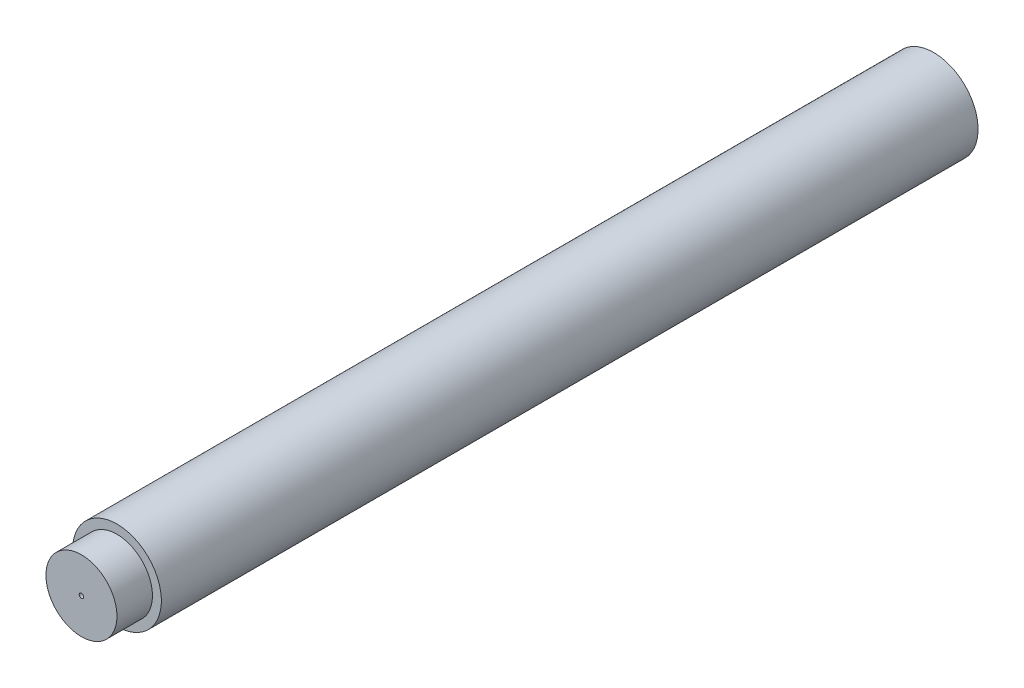
ISO-10303-21;
HEADER;
FILE_DESCRIPTION(('STEP AP214'),'2;1');
FILE_NAME('part.step','',(''),(''),'','','');
FILE_SCHEMA(('AUTOMOTIVE_DESIGN { 1 0 10303 214 1 1 1 1 }'));
ENDSEC;
DATA;
#1=APPLICATION_CONTEXT('core data for automotive mechanical design processes');
#2=APPLICATION_PROTOCOL_DEFINITION('international standard','automotive_design',2000,#1);
#3=PRODUCT_CONTEXT('',#1,'mechanical');
#4=PRODUCT('Part','Part','',(#3));
#5=PRODUCT_RELATED_PRODUCT_CATEGORY('part','',(#4));
#6=PRODUCT_DEFINITION_FORMATION('','',#4);
#7=PRODUCT_DEFINITION_CONTEXT('part definition',#1,'design');
#8=PRODUCT_DEFINITION('design','',#6,#7);
#9=PRODUCT_DEFINITION_SHAPE('','',#8);
#10=(LENGTH_UNIT() NAMED_UNIT(*) SI_UNIT(.MILLI.,.METRE.));
#11=(NAMED_UNIT(*) PLANE_ANGLE_UNIT() SI_UNIT($,.RADIAN.));
#12=(NAMED_UNIT(*) SI_UNIT($,.STERADIAN.) SOLID_ANGLE_UNIT());
#13=UNCERTAINTY_MEASURE_WITH_UNIT(LENGTH_MEASURE(1.E-05),#10,'distance_accuracy_value','');
#14=(GEOMETRIC_REPRESENTATION_CONTEXT(3) GLOBAL_UNCERTAINTY_ASSIGNED_CONTEXT((#13)) GLOBAL_UNIT_ASSIGNED_CONTEXT((#10,
#11,#12)) REPRESENTATION_CONTEXT('',''));
#15=CARTESIAN_POINT('',(0.,0.,0.));
#16=DIRECTION('',(0.,0.,1.));
#17=DIRECTION('',(1.,0.,0.));
#18=AXIS2_PLACEMENT_3D('',#15,#16,#17);
#19=CARTESIAN_POINT('',(0.,0.,76.2));
#20=DIRECTION('',(0.,0.,-1.));
#21=DIRECTION('',(-1.,0.,0.));
#22=AXIS2_PLACEMENT_3D('',#19,#20,#21);
#23=CYLINDRICAL_SURFACE('',#22,7.9375);
#24=CARTESIAN_POINT('',(0.,0.,-76.2));
#25=DIRECTION('',(0.,0.,1.));
#26=DIRECTION('',(1.,0.,0.));
#27=AXIS2_PLACEMENT_3D('',#24,#25,#26);
#28=CIRCLE('',#27,7.9375);
#29=CARTESIAN_POINT('',(-7.9375,0.,-76.2));
#30=VERTEX_POINT('',#29);
#31=EDGE_CURVE('E84',#30,#30,#28,.T.);
#32=CARTESIAN_POINT('',(0.,0.,69.85));
#33=DIRECTION('',(0.,0.,1.));
#34=DIRECTION('',(1.,0.,0.));
#35=AXIS2_PLACEMENT_3D('',#32,#33,#34);
#36=CIRCLE('',#35,7.9375);
#37=CARTESIAN_POINT('',(-7.9375,0.,69.85));
#38=VERTEX_POINT('',#37);
#39=EDGE_CURVE('E90',#38,#38,#36,.T.);
#40=CARTESIAN_POINT('',(-7.9375,0.,-76.2));
#41=CARTESIAN_POINT('',(-7.9375,0.,-74.6786458333333));
#42=CARTESIAN_POINT('',(-7.9375,0.,-73.1572916666667));
#43=CARTESIAN_POINT('',(-7.9375,0.,-70.1145833333333));
#44=CARTESIAN_POINT('',(-7.9375,0.,-68.5932291666667));
#45=CARTESIAN_POINT('',(-7.9375,0.,-65.5505208333333));
#46=CARTESIAN_POINT('',(-7.9375,0.,-64.0291666666667));
#47=CARTESIAN_POINT('',(-7.9375,0.,-60.9864583333333));
#48=CARTESIAN_POINT('',(-7.9375,0.,-59.4651041666667));
#49=CARTESIAN_POINT('',(-7.9375,0.,-56.4223958333333));
#50=CARTESIAN_POINT('',(-7.9375,0.,-54.9010416666667));
#51=CARTESIAN_POINT('',(-7.9375,0.,-51.8583333333333));
#52=CARTESIAN_POINT('',(-7.9375,0.,-50.3369791666667));
#53=CARTESIAN_POINT('',(-7.9375,0.,-47.2942708333333));
#54=CARTESIAN_POINT('',(-7.9375,0.,-45.7729166666667));
#55=CARTESIAN_POINT('',(-7.9375,0.,-42.7302083333333));
#56=CARTESIAN_POINT('',(-7.9375,0.,-41.2088541666667));
#57=CARTESIAN_POINT('',(-7.9375,0.,-38.1661458333333));
#58=CARTESIAN_POINT('',(-7.9375,0.,-36.6447916666667));
#59=CARTESIAN_POINT('',(-7.9375,0.,-33.6020833333333));
#60=CARTESIAN_POINT('',(-7.9375,0.,-32.0807291666667));
#61=CARTESIAN_POINT('',(-7.9375,0.,-29.0380208333333));
#62=CARTESIAN_POINT('',(-7.9375,0.,-27.5166666666667));
#63=CARTESIAN_POINT('',(-7.9375,0.,-24.4739583333333));
#64=CARTESIAN_POINT('',(-7.9375,0.,-22.9526041666667));
#65=CARTESIAN_POINT('',(-7.9375,0.,-19.9098958333333));
#66=CARTESIAN_POINT('',(-7.9375,0.,-18.3885416666667));
#67=CARTESIAN_POINT('',(-7.9375,0.,-15.3458333333333));
#68=CARTESIAN_POINT('',(-7.9375,0.,-13.8244791666667));
#69=CARTESIAN_POINT('',(-7.9375,0.,-10.7817708333333));
#70=CARTESIAN_POINT('',(-7.9375,0.,-9.26041666666667));
#71=CARTESIAN_POINT('',(-7.9375,0.,-6.21770833333334));
#72=CARTESIAN_POINT('',(-7.9375,0.,-4.69635416666667));
#73=CARTESIAN_POINT('',(-7.9375,0.,-1.65364583333333));
#74=CARTESIAN_POINT('',(-7.9375,0.,-0.132291666666659));
#75=CARTESIAN_POINT('',(-7.9375,0.,2.91041666666667));
#76=CARTESIAN_POINT('',(-7.9375,0.,4.43177083333334));
#77=CARTESIAN_POINT('',(-7.9375,0.,7.47447916666667));
#78=CARTESIAN_POINT('',(-7.9375,0.,8.99583333333334));
#79=CARTESIAN_POINT('',(-7.9375,0.,12.0385416666667));
#80=CARTESIAN_POINT('',(-7.9375,0.,13.5598958333333));
#81=CARTESIAN_POINT('',(-7.9375,0.,16.6026041666667));
#82=CARTESIAN_POINT('',(-7.9375,0.,18.1239583333333));
#83=CARTESIAN_POINT('',(-7.9375,0.,21.1666666666667));
#84=CARTESIAN_POINT('',(-7.9375,0.,22.6880208333333));
#85=CARTESIAN_POINT('',(-7.9375,0.,25.7307291666667));
#86=CARTESIAN_POINT('',(-7.9375,0.,27.2520833333333));
#87=CARTESIAN_POINT('',(-7.9375,0.,30.2947916666667));
#88=CARTESIAN_POINT('',(-7.9375,0.,31.8161458333333));
#89=CARTESIAN_POINT('',(-7.9375,0.,34.8588541666667));
#90=CARTESIAN_POINT('',(-7.9375,0.,36.3802083333333));
#91=CARTESIAN_POINT('',(-7.9375,0.,39.4229166666667));
#92=CARTESIAN_POINT('',(-7.9375,0.,40.9442708333333));
#93=CARTESIAN_POINT('',(-7.9375,0.,43.9869791666667));
#94=CARTESIAN_POINT('',(-7.9375,0.,45.5083333333333));
#95=CARTESIAN_POINT('',(-7.9375,0.,48.5510416666667));
#96=CARTESIAN_POINT('',(-7.9375,0.,50.0723958333333));
#97=CARTESIAN_POINT('',(-7.9375,0.,53.1151041666667));
#98=CARTESIAN_POINT('',(-7.9375,0.,54.6364583333333));
#99=CARTESIAN_POINT('',(-7.9375,0.,57.6791666666667));
#100=CARTESIAN_POINT('',(-7.9375,0.,59.2005208333333));
#101=CARTESIAN_POINT('',(-7.9375,0.,62.2432291666667));
#102=CARTESIAN_POINT('',(-7.9375,0.,63.7645833333333));
#103=CARTESIAN_POINT('',(-7.9375,0.,66.8072916666667));
#104=CARTESIAN_POINT('',(-7.9375,0.,68.3286458333333));
#105=CARTESIAN_POINT('',(-7.9375,0.,69.85));
#106=B_SPLINE_CURVE_WITH_KNOTS('',3,(#40,#41,#42,#43,#44,#45,#46,#47,#48,#49,#50,#51,#52,#53,
#54,#55,#56,#57,#58,#59,#60,#61,#62,#63,#64,#65,#66,#67,#68,#69,#70,#71,#72,#73,#74,#75,#76,#77,
#78,#79,#80,#81,#82,#83,#84,#85,#86,#87,#88,#89,#90,#91,#92,#93,#94,#95,#96,#97,#98,#99,#100,
#101,#102,#103,#104,#105),.UNSPECIFIED.,.F.,.F.,(4,2,2,2,2,2,2,2,2,2,2,2,2,2,2,2,2,2,2,2,2,2,2,
2,2,2,2,2,2,2,2,2,4),(0.,4.56406249999999,9.12812500000001,13.6921875,18.25625,22.8203125,
27.384375,31.9484375,36.5125,41.0765625,45.640625,50.2046875,54.76875,59.3328125,63.896875,
68.4609375,73.025,77.5890625,82.153125,86.7171875,91.28125,95.8453125,100.409375,104.9734375,
109.5375,114.1015625,118.665625,123.2296875,127.79375,132.3578125,136.921875,141.4859375,
146.05),.UNSPECIFIED.);
#107=EDGE_CURVE('BSEAM64',#30,#38,#106,.T.);
#108=ORIENTED_EDGE('',*,*,#31,.T.);
#109=ORIENTED_EDGE('',*,*,#39,.F.);
#110=ORIENTED_EDGE('',*,*,#107,.T.);
#111=ORIENTED_EDGE('',*,*,#107,.F.);
#112=EDGE_LOOP('',(#108,#110,#109,#111));
#113=FACE_BOUND('',#112,.T.);
#114=ADVANCED_FACE('F64',(#113),#23,.T.);
#115=CARTESIAN_POINT('',(0.,0.,-76.2));
#116=DIRECTION('',(0.,0.,1.));
#117=DIRECTION('',(1.,0.,0.));
#118=AXIS2_PLACEMENT_3D('',#115,#116,#117);
#119=PLANE('',#118);
#120=CARTESIAN_POINT('',(-3.889375,0.,-76.2));
#121=CARTESIAN_POINT('',(-3.889375,0.509117991351373,-76.2));
#122=CARTESIAN_POINT('',(-3.78814497717016,1.01803568291222,-76.2));
#123=CARTESIAN_POINT('',(-3.398482936352,1.95876306659773,-76.2));
#124=CARTESIAN_POINT('',(-3.11020422118614,2.39020265296883,-76.2));
#125=CARTESIAN_POINT('',(-2.39020265296872,3.11020422118603,-76.2));
#126=CARTESIAN_POINT('',(-1.95876306659776,3.39848293635195,-76.2));
#127=CARTESIAN_POINT('',(-1.01803568291218,3.78814497717022,-76.2));
#128=CARTESIAN_POINT('',(-0.509117991351372,3.889375,-76.2));
#129=CARTESIAN_POINT('',(0.509117991351373,3.889375,-76.2));
#130=CARTESIAN_POINT('',(1.01803568291212,3.78814497717011,-76.2));
#131=CARTESIAN_POINT('',(1.95876306659782,3.39848293635206,-76.2));
#132=CARTESIAN_POINT('',(2.39020265296887,3.11020422118609,-76.2));
#133=CARTESIAN_POINT('',(3.11020422118598,2.39020265296876,-76.2));
#134=CARTESIAN_POINT('',(3.39848293635202,1.95876306659775,-76.2));
#135=CARTESIAN_POINT('',(3.78814497717015,1.01803568291219,-76.2));
#136=CARTESIAN_POINT('',(3.889375,0.509117991351909,-76.2));
#137=CARTESIAN_POINT('',(3.889375,-0.509117991351909,-76.2));
#138=CARTESIAN_POINT('',(3.78814497717004,-1.01803568291246,-76.2));
#139=CARTESIAN_POINT('',(3.39848293635213,-1.95876306659748,-76.2));
#140=CARTESIAN_POINT('',(3.11020422118588,-2.39020265296898,-76.2));
#141=CARTESIAN_POINT('',(2.39020265296899,-3.11020422118587,-76.2));
#142=CARTESIAN_POINT('',(1.95876306659821,-3.39848293635184,-76.2));
#143=CARTESIAN_POINT('',(1.01803568291174,-3.78814497717033,-76.2));
#144=CARTESIAN_POINT('',(0.509117991350936,-3.889375,-76.2));
#145=CARTESIAN_POINT('',(-0.50911799135093,-3.889375,-76.2));
#146=CARTESIAN_POINT('',(-1.01803568291257,-3.78814497717011,-76.2));
#147=CARTESIAN_POINT('',(-1.95876306659738,-3.39848293635206,-76.2));
#148=CARTESIAN_POINT('',(-2.39020265296883,-3.11020422118603,-76.2));
#149=CARTESIAN_POINT('',(-3.11020422118603,-2.39020265296883,-76.2));
#150=CARTESIAN_POINT('',(-3.39848293635201,-1.95876306659778,-76.2));
#151=CARTESIAN_POINT('',(-3.78814497717017,-1.01803568291215,-76.2));
#152=CARTESIAN_POINT('',(-3.889375,-0.509117991351372,-76.2));
#153=CARTESIAN_POINT('',(-3.889375,0.,-76.2));
#154=(BOUNDED_CURVE() B_SPLINE_CURVE(3,(#120,#121,#122,#123,#124,#125,#126,#127,#128,#129,#130,
#131,#132,#133,#134,#135,#136,#137,#138,#139,#140,#141,#142,#143,#144,#145,#146,#147,#148,#149,
#150,#151,#152,#153),.UNSPECIFIED.,.T.,.F.) B_SPLINE_CURVE_WITH_KNOTS((4,2,2,2,2,2,2,2,2,2,2,2,
2,2,2,2,4),(-3.14159265358979,-2.74889357189107,-2.35619449019234,-1.96349540849362,
-1.5707963267949,-1.17809724509617,-0.785398163397448,-0.392699081698724,0.,0.392699081698724,
0.785398163397448,1.17809724509617,1.5707963267949,1.96349540849362,2.35619449019234,
2.74889357189107,3.14159265358979),
.UNSPECIFIED.) CURVE() GEOMETRIC_REPRESENTATION_ITEM() RATIONAL_B_SPLINE_CURVE((1.,1.,1.,1.,1.,
1.,1.,1.,1.,1.,1.,1.,1.,1.,1.,1.,1.,1.,1.,1.,1.,1.,1.,1.,1.,1.,1.,1.,1.,1.,1.,1.,1.,1.)) REPRESENTATION_ITEM(''));
#155=CARTESIAN_POINT('',(-3.889375,0.,-76.2));
#156=VERTEX_POINT('',#155);
#157=EDGE_CURVE('E13',#156,#156,#154,.F.);
#158=ORIENTED_EDGE('',*,*,#157,.T.);
#159=EDGE_LOOP('',(#158));
#160=FACE_BOUND('',#159,.T.);
#161=ORIENTED_EDGE('',*,*,#31,.F.);
#162=EDGE_LOOP('',(#161));
#163=FACE_BOUND('',#162,.T.);
#164=ADVANCED_FACE('F123',(#160,#163),#119,.F.);
#165=CARTESIAN_POINT('',(0.,0.,69.85));
#166=DIRECTION('',(0.,0.,1.));
#167=DIRECTION('',(1.,0.,0.));
#168=AXIS2_PLACEMENT_3D('',#165,#166,#167);
#169=PLANE('',#168);
#170=CARTESIAN_POINT('',(0.,0.,69.85));
#171=DIRECTION('',(0.,0.,1.));
#172=DIRECTION('',(1.,0.,0.));
#173=AXIS2_PLACEMENT_3D('',#170,#171,#172);
#174=CIRCLE('',#173,6.35);
#175=CARTESIAN_POINT('',(6.35,0.,69.85));
#176=VERTEX_POINT('',#175);
#177=EDGE_CURVE('E96',#176,#176,#174,.T.);
#178=ORIENTED_EDGE('',*,*,#177,.F.);
#179=EDGE_LOOP('',(#178));
#180=FACE_BOUND('',#179,.T.);
#181=ORIENTED_EDGE('',*,*,#39,.T.);
#182=EDGE_LOOP('',(#181));
#183=FACE_BOUND('',#182,.T.);
#184=ADVANCED_FACE('F119',(#180,#183),#169,.T.);
#185=CARTESIAN_POINT('',(0.,0.,69.85));
#186=DIRECTION('',(0.,0.,1.));
#187=DIRECTION('',(1.,0.,0.));
#188=AXIS2_PLACEMENT_3D('',#185,#186,#187);
#189=CYLINDRICAL_SURFACE('',#188,6.35);
#190=ORIENTED_EDGE('',*,*,#177,.T.);
#191=EDGE_LOOP('',(#190));
#192=FACE_BOUND('',#191,.T.);
#193=CARTESIAN_POINT('',(0.,0.,76.2));
#194=DIRECTION('',(0.,0.,1.));
#195=DIRECTION('',(1.,0.,0.));
#196=AXIS2_PLACEMENT_3D('',#193,#194,#195);
#197=CIRCLE('',#196,6.35);
#198=CARTESIAN_POINT('',(6.35,0.,76.2));
#199=VERTEX_POINT('',#198);
#200=EDGE_CURVE('E99',#199,#199,#197,.T.);
#201=ORIENTED_EDGE('',*,*,#200,.F.);
#202=EDGE_LOOP('',(#201));
#203=FACE_BOUND('',#202,.T.);
#204=ADVANCED_FACE('F116',(#192,#203),#189,.T.);
#205=CARTESIAN_POINT('',(0.,0.,76.2));
#206=DIRECTION('',(0.,0.,1.));
#207=DIRECTION('',(1.,0.,0.));
#208=AXIS2_PLACEMENT_3D('',#205,#206,#207);
#209=PLANE('',#208);
#210=CARTESIAN_POINT('',(0.,0.,76.2));
#211=DIRECTION('',(0.,0.,-1.));
#212=DIRECTION('',(-1.,0.,0.));
#213=AXIS2_PLACEMENT_3D('',#210,#211,#212);
#214=CIRCLE('',#213,0.396875);
#215=CARTESIAN_POINT('',(-0.396875,0.,76.2));
#216=VERTEX_POINT('',#215);
#217=EDGE_CURVE('E207',#216,#216,#214,.T.);
#218=ORIENTED_EDGE('',*,*,#217,.T.);
#219=EDGE_LOOP('',(#218));
#220=FACE_BOUND('',#219,.T.);
#221=ORIENTED_EDGE('',*,*,#200,.T.);
#222=EDGE_LOOP('',(#221));
#223=FACE_BOUND('',#222,.T.);
#224=ADVANCED_FACE('F115',(#220,#223),#209,.T.);
#225=CARTESIAN_POINT('',(0.,0.,76.2));
#226=DIRECTION('',(0.,0.,-1.));
#227=DIRECTION('',(-1.,0.,0.));
#228=AXIS2_PLACEMENT_3D('',#225,#226,#227);
#229=CYLINDRICAL_SURFACE('',#228,0.396875);
#230=CARTESIAN_POINT('',(-0.396875000000001,0.,-63.4999999999999));
#231=CARTESIAN_POINT('',(-0.396875000000001,-0.0519508154440175,-63.4999999999999));
#232=CARTESIAN_POINT('',(-0.386545405833682,-0.103881192133936,-63.4999999999999));
#233=CARTESIAN_POINT('',(-0.346783973097153,-0.199873782305853,-63.4999999999999));
#234=CARTESIAN_POINT('',(-0.317367777672095,-0.243898229894727,-63.4999999999999));
#235=CARTESIAN_POINT('',(-0.243898229894726,-0.317367777672096,-63.4999999999999));
#236=CARTESIAN_POINT('',(-0.199873782305843,-0.346783973097156,-63.4999999999999));
#237=CARTESIAN_POINT('',(-0.103881192133948,-0.386545405833678,-63.4999999999999));
#238=CARTESIAN_POINT('',(-0.0519508154439724,-0.396875000000001,-63.4999999999999));
#239=CARTESIAN_POINT('',(0.051950815443973,-0.396875,-63.4999999999999));
#240=CARTESIAN_POINT('',(0.103881192133837,-0.386545405833723,-63.4999999999999));
#241=CARTESIAN_POINT('',(0.199873782305953,-0.346783973097111,-63.4999999999999));
#242=CARTESIAN_POINT('',(0.243898229894687,-0.317367777672135,-63.4999999999999));
#243=CARTESIAN_POINT('',(0.317367777672135,-0.243898229894687,-63.4999999999999));
#244=CARTESIAN_POINT('',(0.346783973097145,-0.199873782305869,-63.4999999999999));
#245=CARTESIAN_POINT('',(0.386545405833688,-0.103881192133921,-63.4999999999999));
#246=CARTESIAN_POINT('',(0.396875000000001,-0.0519508154440724,-63.4999999999999));
#247=CARTESIAN_POINT('',(0.396875000000001,0.0519508154440724,-63.4999999999999));
#248=CARTESIAN_POINT('',(0.386545405833705,0.103881192133882,-63.4999999999999));
#249=CARTESIAN_POINT('',(0.346783973097129,0.199873782305908,-63.4999999999999));
#250=CARTESIAN_POINT('',(0.31736777767208,0.243898229894743,-63.4999999999999));
#251=CARTESIAN_POINT('',(0.243898229894743,0.31736777767208,-63.4999999999999));
#252=CARTESIAN_POINT('',(0.199873782305914,0.346783973097128,-63.4999999999999));
#253=CARTESIAN_POINT('',(0.103881192133876,0.386545405833708,-63.4999999999999));
#254=CARTESIAN_POINT('',(0.0519508154440176,0.396875000000001,-63.4999999999999));
#255=CARTESIAN_POINT('',(-0.0519508154440175,0.396875000000001,-63.4999999999999));
#256=CARTESIAN_POINT('',(-0.103881192133948,0.386545405833678,-63.4999999999999));
#257=CARTESIAN_POINT('',(-0.199873782305843,0.346783973097156,-63.4999999999999));
#258=CARTESIAN_POINT('',(-0.243898229894672,0.317367777672151,-63.4999999999999));
#259=CARTESIAN_POINT('',(-0.317367777672151,0.243898229894671,-63.4999999999999));
#260=CARTESIAN_POINT('',(-0.346783973097133,0.199873782305901,-63.4999999999999));
#261=CARTESIAN_POINT('',(-0.386545405833702,0.10388119213389,-63.4999999999999));
#262=CARTESIAN_POINT('',(-0.396875000000001,0.0519508154440176,-63.4999999999999));
#263=CARTESIAN_POINT('',(-0.396875000000001,0.,-63.4999999999999));
#264=(BOUNDED_CURVE() B_SPLINE_CURVE(3,(#230,#231,#232,#233,#234,#235,#236,#237,#238,#239,#240,
#241,#242,#243,#244,#245,#246,#247,#248,#249,#250,#251,#252,#253,#254,#255,#256,#257,#258,#259,
#260,#261,#262,#263),.UNSPECIFIED.,.T.,.F.) B_SPLINE_CURVE_WITH_KNOTS((4,2,2,2,2,2,2,2,2,2,2,2,
2,2,2,2,4),(-3.14159265358979,-2.74889357189107,-2.35619449019234,-1.96349540849362,
-1.5707963267949,-1.17809724509617,-0.785398163397448,-0.392699081698724,0.,0.392699081698724,
0.785398163397448,1.17809724509617,1.5707963267949,1.96349540849362,2.35619449019234,
2.74889357189107,3.14159265358979),
.UNSPECIFIED.) CURVE() GEOMETRIC_REPRESENTATION_ITEM() RATIONAL_B_SPLINE_CURVE((1.,1.,1.,1.,1.,
1.,1.,1.,1.,1.,1.,1.,1.,1.,1.,1.,1.,1.,1.,1.,1.,1.,1.,1.,1.,1.,1.,1.,1.,1.,1.,1.,1.,1.)) REPRESENTATION_ITEM(''));
#265=CARTESIAN_POINT('',(-0.396875000000001,0.,-63.4999999999999));
#266=VERTEX_POINT('',#265);
#267=EDGE_CURVE('E78',#266,#266,#264,.F.);
#268=ORIENTED_EDGE('',*,*,#267,.T.);
#269=EDGE_LOOP('',(#268));
#270=FACE_BOUND('',#269,.T.);
#271=ORIENTED_EDGE('',*,*,#217,.F.);
#272=EDGE_LOOP('',(#271));
#273=FACE_BOUND('',#272,.T.);
#274=ADVANCED_FACE('F106',(#270,#273),#229,.F.);
#275=CARTESIAN_POINT('',(-3.889375,0.,-76.2));
#276=CARTESIAN_POINT('',(-3.889375,-0.509117991351372,-76.2));
#277=CARTESIAN_POINT('',(-3.78814497717017,-1.01803568291215,-76.2));
#278=CARTESIAN_POINT('',(-3.39848293635201,-1.95876306659778,-76.2));
#279=CARTESIAN_POINT('',(-3.11020422118603,-2.39020265296883,-76.2));
#280=CARTESIAN_POINT('',(-2.39020265296883,-3.11020422118603,-76.2));
#281=CARTESIAN_POINT('',(-1.95876306659738,-3.39848293635206,-76.2));
#282=CARTESIAN_POINT('',(-1.01803568291257,-3.78814497717011,-76.2));
#283=CARTESIAN_POINT('',(-0.50911799135093,-3.889375,-76.2));
#284=CARTESIAN_POINT('',(0.509117991350936,-3.889375,-76.2));
#285=CARTESIAN_POINT('',(1.01803568291174,-3.78814497717033,-76.2));
#286=CARTESIAN_POINT('',(1.95876306659821,-3.39848293635184,-76.2));
#287=CARTESIAN_POINT('',(2.39020265296899,-3.11020422118587,-76.2));
#288=CARTESIAN_POINT('',(3.11020422118588,-2.39020265296898,-76.2));
#289=CARTESIAN_POINT('',(3.39848293635213,-1.95876306659748,-76.2));
#290=CARTESIAN_POINT('',(3.78814497717004,-1.01803568291246,-76.2));
#291=CARTESIAN_POINT('',(3.889375,-0.509117991351909,-76.2));
#292=CARTESIAN_POINT('',(3.889375,0.509117991351909,-76.2));
#293=CARTESIAN_POINT('',(3.78814497717015,1.01803568291219,-76.2));
#294=CARTESIAN_POINT('',(3.39848293635202,1.95876306659775,-76.2));
#295=CARTESIAN_POINT('',(3.11020422118598,2.39020265296876,-76.2));
#296=CARTESIAN_POINT('',(2.39020265296887,3.11020422118609,-76.2));
#297=CARTESIAN_POINT('',(1.95876306659782,3.39848293635206,-76.2));
#298=CARTESIAN_POINT('',(1.01803568291212,3.78814497717011,-76.2));
#299=CARTESIAN_POINT('',(0.509117991351373,3.889375,-76.2));
#300=CARTESIAN_POINT('',(-0.509117991351372,3.889375,-76.2));
#301=CARTESIAN_POINT('',(-1.01803568291218,3.78814497717022,-76.2));
#302=CARTESIAN_POINT('',(-1.95876306659776,3.39848293635195,-76.2));
#303=CARTESIAN_POINT('',(-2.39020265296872,3.11020422118603,-76.2));
#304=CARTESIAN_POINT('',(-3.11020422118614,2.39020265296883,-76.2));
#305=CARTESIAN_POINT('',(-3.398482936352,1.95876306659773,-76.2));
#306=CARTESIAN_POINT('',(-3.78814497717016,1.01803568291222,-76.2));
#307=CARTESIAN_POINT('',(-3.889375,0.509117991351373,-76.2));
#308=CARTESIAN_POINT('',(-3.889375,0.,-76.2));
#309=CARTESIAN_POINT('',(-0.396874999999799,0.,-76.2));
#310=CARTESIAN_POINT('',(-0.396874999999799,-0.0519508154439911,-76.2));
#311=CARTESIAN_POINT('',(-0.386545405833027,-0.103881192133812,-76.2));
#312=CARTESIAN_POINT('',(-0.346783973097436,-0.199873782305823,-76.2));
#313=CARTESIAN_POINT('',(-0.317367777671732,-0.243898229894474,-76.2));
#314=CARTESIAN_POINT('',(-0.243898229894805,-0.317367777672064,-76.2));
#315=CARTESIAN_POINT('',(-0.199873782305838,-0.346783973097121,-76.2));
#316=CARTESIAN_POINT('',(-0.103881192133799,-0.386545405833341,-76.2));
#317=CARTESIAN_POINT('',(-0.051950815443946,-0.396874999999799,-76.2));
#318=CARTESIAN_POINT('',(0.0519508154439466,-0.396874999999799,-76.2));
#319=CARTESIAN_POINT('',(0.103881192133688,-0.386545405833341,-76.2));
#320=CARTESIAN_POINT('',(0.199873782305948,-0.346783973097121,-76.2));
#321=CARTESIAN_POINT('',(0.24389822989449,-0.317367777672048,-76.2));
#322=CARTESIAN_POINT('',(0.317367777672048,-0.24389822989449,-76.2));
#323=CARTESIAN_POINT('',(0.346783973096895,-0.199873782305847,-76.2));
#324=CARTESIAN_POINT('',(0.386545405833565,-0.103881192133787,-76.2));
#325=CARTESIAN_POINT('',(0.396874999999799,-0.051950815444046,-76.2));
#326=CARTESIAN_POINT('',(0.396874999999799,0.051950815444046,-76.2));
#327=CARTESIAN_POINT('',(0.386545405833455,0.103881192133843,-76.2));
#328=CARTESIAN_POINT('',(0.346783973097006,0.199873782305793,-76.2));
#329=CARTESIAN_POINT('',(0.317367777672048,0.243898229894379,-76.2));
#330=CARTESIAN_POINT('',(0.24389822989449,0.317367777672158,-76.2));
#331=CARTESIAN_POINT('',(0.199873782305948,0.346783973097343,-76.2));
#332=CARTESIAN_POINT('',(0.103881192133688,0.386545405833121,-76.2));
#333=CARTESIAN_POINT('',(0.0519508154439911,0.396874999999799,-76.2));
#334=CARTESIAN_POINT('',(-0.0519508154439911,0.396874999999799,-76.2));
#335=CARTESIAN_POINT('',(-0.103881192134019,0.386545405833672,-76.2));
#336=CARTESIAN_POINT('',(-0.199873782305617,0.346783973096789,-76.2));
#337=CARTESIAN_POINT('',(-0.243898229894695,0.317367777671954,-76.2));
#338=CARTESIAN_POINT('',(-0.317367777671844,0.243898229894584,-76.2));
#339=CARTESIAN_POINT('',(-0.346783973097213,0.199873782305824,-76.2));
#340=CARTESIAN_POINT('',(-0.386545405833247,0.103881192133813,-76.2));
#341=CARTESIAN_POINT('',(-0.396874999999799,0.0519508154439912,-76.2));
#342=CARTESIAN_POINT('',(-0.396874999999799,0.,-76.2));
#343=CARTESIAN_POINT('',(-0.396875000000001,0.,-63.4999999999999));
#344=CARTESIAN_POINT('',(-0.396875000000001,-0.0519508154440175,-63.4999999999999));
#345=CARTESIAN_POINT('',(-0.386545405833682,-0.103881192133936,-63.4999999999999));
#346=CARTESIAN_POINT('',(-0.346783973097153,-0.199873782305853,-63.4999999999999));
#347=CARTESIAN_POINT('',(-0.317367777672095,-0.243898229894727,-63.4999999999999));
#348=CARTESIAN_POINT('',(-0.243898229894726,-0.317367777672096,-63.4999999999999));
#349=CARTESIAN_POINT('',(-0.199873782305843,-0.346783973097156,-63.4999999999999));
#350=CARTESIAN_POINT('',(-0.103881192133948,-0.386545405833678,-63.4999999999999));
#351=CARTESIAN_POINT('',(-0.0519508154439724,-0.396875000000001,-63.4999999999999));
#352=CARTESIAN_POINT('',(0.051950815443973,-0.396875,-63.4999999999999));
#353=CARTESIAN_POINT('',(0.103881192133837,-0.386545405833723,-63.4999999999999));
#354=CARTESIAN_POINT('',(0.199873782305953,-0.346783973097111,-63.4999999999999));
#355=CARTESIAN_POINT('',(0.243898229894687,-0.317367777672135,-63.4999999999999));
#356=CARTESIAN_POINT('',(0.317367777672135,-0.243898229894687,-63.4999999999999));
#357=CARTESIAN_POINT('',(0.346783973097145,-0.199873782305869,-63.4999999999999));
#358=CARTESIAN_POINT('',(0.386545405833688,-0.103881192133921,-63.4999999999999));
#359=CARTESIAN_POINT('',(0.396875000000001,-0.0519508154440724,-63.4999999999999));
#360=CARTESIAN_POINT('',(0.396875000000001,0.0519508154440724,-63.4999999999999));
#361=CARTESIAN_POINT('',(0.386545405833705,0.103881192133882,-63.4999999999999));
#362=CARTESIAN_POINT('',(0.346783973097129,0.199873782305908,-63.4999999999999));
#363=CARTESIAN_POINT('',(0.31736777767208,0.243898229894743,-63.4999999999999));
#364=CARTESIAN_POINT('',(0.243898229894743,0.31736777767208,-63.4999999999999));
#365=CARTESIAN_POINT('',(0.199873782305914,0.346783973097128,-63.4999999999999));
#366=CARTESIAN_POINT('',(0.103881192133876,0.386545405833708,-63.4999999999999));
#367=CARTESIAN_POINT('',(0.0519508154440176,0.396875000000001,-63.4999999999999));
#368=CARTESIAN_POINT('',(-0.0519508154440175,0.396875000000001,-63.4999999999999));
#369=CARTESIAN_POINT('',(-0.103881192133948,0.386545405833678,-63.4999999999999));
#370=CARTESIAN_POINT('',(-0.199873782305843,0.346783973097156,-63.4999999999999));
#371=CARTESIAN_POINT('',(-0.243898229894672,0.317367777672151,-63.4999999999999));
#372=CARTESIAN_POINT('',(-0.317367777672151,0.243898229894671,-63.4999999999999));
#373=CARTESIAN_POINT('',(-0.346783973097133,0.199873782305901,-63.4999999999999));
#374=CARTESIAN_POINT('',(-0.386545405833702,0.10388119213389,-63.4999999999999));
#375=CARTESIAN_POINT('',(-0.396875000000001,0.0519508154440176,-63.4999999999999));
#376=CARTESIAN_POINT('',(-0.396875000000001,0.,-63.4999999999999));
#377=(BOUNDED_SURFACE() B_SPLINE_SURFACE(2,3,((#275,#276,#277,#278,#279,#280,#281,#282,#283,
#284,#285,#286,#287,#288,#289,#290,#291,#292,#293,#294,#295,#296,#297,#298,#299,#300,#301,#302,
#303,#304,#305,#306,#307,#308),(#309,#310,#311,#312,#313,#314,#315,#316,#317,#318,#319,#320,
#321,#322,#323,#324,#325,#326,#327,#328,#329,#330,#331,#332,#333,#334,#335,#336,#337,#338,#339,
#340,#341,#342),(#343,#344,#345,#346,#347,#348,#349,#350,#351,#352,#353,#354,#355,#356,#357,
#358,#359,#360,#361,#362,#363,#364,#365,#366,#367,#368,#369,#370,#371,#372,#373,#374,#375,
#376)),.UNSPECIFIED.,.F.,.T.,.F.) B_SPLINE_SURFACE_WITH_KNOTS((3,3),(4,2,2,2,2,2,2,2,2,2,2,2,2,
2,2,2,4),(0.,1.),(-3.14159265358979,-2.74889357189107,-2.35619449019234,-1.96349540849362,
-1.5707963267949,-1.17809724509617,-0.785398163397448,-0.392699081698724,0.,0.392699081698724,
0.785398163397448,1.17809724509617,1.5707963267949,1.96349540849362,2.35619449019234,
2.74889357189107,3.14159265358979),
.UNSPECIFIED.) GEOMETRIC_REPRESENTATION_ITEM() RATIONAL_B_SPLINE_SURFACE(((1.,1.,1.,1.,1.,1.,1.,
1.,1.,1.,1.,1.,1.,1.,1.,1.,1.,1.,1.,1.,1.,1.,1.,1.,1.,1.,1.,1.,1.,1.,1.,1.,1.,1.),(0.25,0.25,
0.25,0.25,0.25,0.25,0.25,0.25,0.25,0.25,0.25,0.25,0.25,0.25,0.25,0.25,0.25,0.25,0.25,0.25,0.25,
0.25,0.25,0.25,0.25,0.25,0.25,0.25,0.25,0.25,0.25,0.25,0.25,0.25),(1.,1.,1.,1.,1.,1.,1.,1.,1.,
1.,1.,1.,1.,1.,1.,1.,1.,1.,1.,1.,1.,1.,1.,1.,1.,1.,1.,1.,1.,1.,1.,1.,1.,1.))) REPRESENTATION_ITEM('') SURFACE());
#378=ORIENTED_EDGE('',*,*,#157,.F.);
#379=EDGE_LOOP('',(#378));
#380=FACE_BOUND('',#379,.T.);
#381=ORIENTED_EDGE('',*,*,#267,.F.);
#382=EDGE_LOOP('',(#381));
#383=FACE_BOUND('',#382,.T.);
#384=ADVANCED_FACE('F67',(#380,#383),#377,.T.);
#385=CLOSED_SHELL('',(#114,#164,#184,#204,#224,#274,#384));
#386=MANIFOLD_SOLID_BREP('B2',#385);
#387=ADVANCED_BREP_SHAPE_REPRESENTATION('',(#18,#386),#14);
#388=SHAPE_DEFINITION_REPRESENTATION(#9,#387);
ENDSEC;
END-ISO-10303-21;
